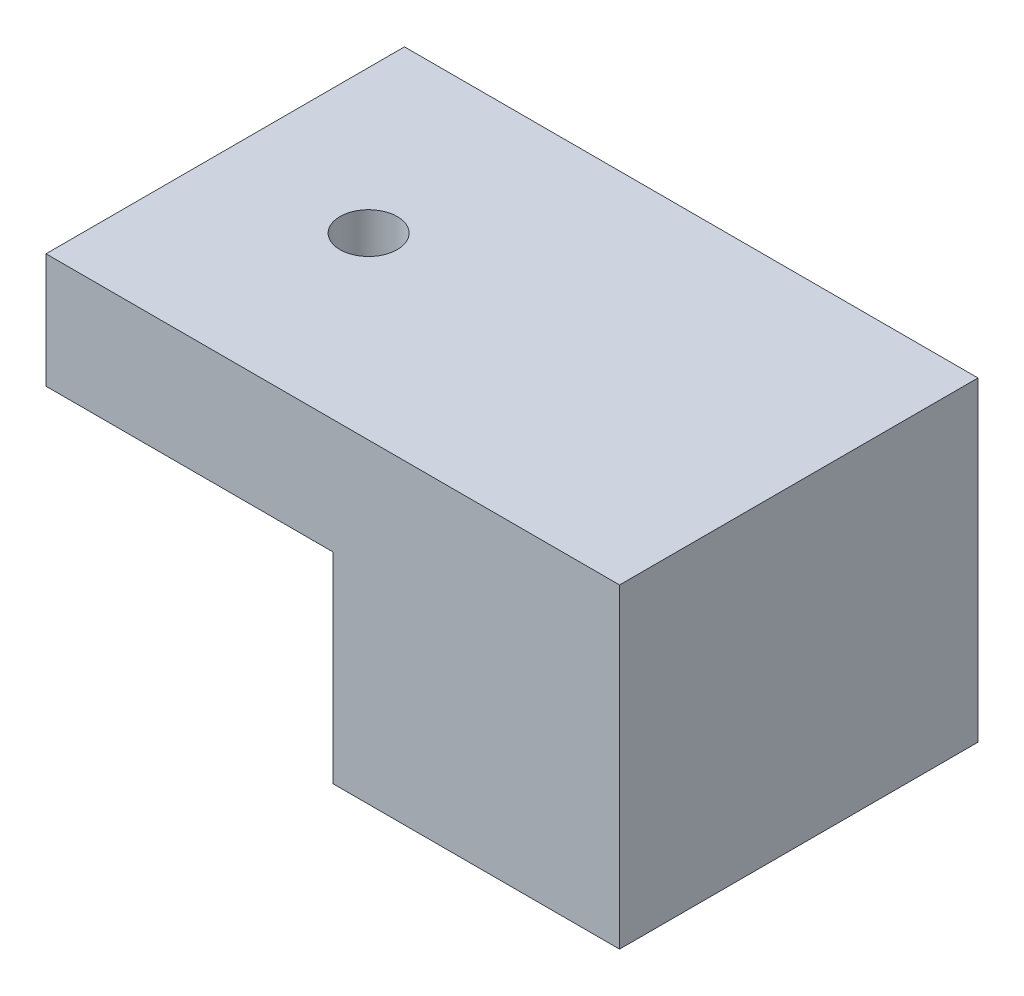
ISO-10303-21;
HEADER;
FILE_DESCRIPTION(('STEP AP214'),'2;1');
FILE_NAME('part.step','',(''),(''),'','','');
FILE_SCHEMA(('AUTOMOTIVE_DESIGN { 1 0 10303 214 1 1 1 1 }'));
ENDSEC;
DATA;
#1=APPLICATION_CONTEXT('core data for automotive mechanical design processes');
#2=APPLICATION_PROTOCOL_DEFINITION('international standard','automotive_design',2000,#1);
#3=PRODUCT_CONTEXT('',#1,'mechanical');
#4=PRODUCT('Part','Part','',(#3));
#5=PRODUCT_RELATED_PRODUCT_CATEGORY('part','',(#4));
#6=PRODUCT_DEFINITION_FORMATION('','',#4);
#7=PRODUCT_DEFINITION_CONTEXT('part definition',#1,'design');
#8=PRODUCT_DEFINITION('design','',#6,#7);
#9=PRODUCT_DEFINITION_SHAPE('','',#8);
#10=(LENGTH_UNIT() NAMED_UNIT(*) SI_UNIT(.MILLI.,.METRE.));
#11=(NAMED_UNIT(*) PLANE_ANGLE_UNIT() SI_UNIT($,.RADIAN.));
#12=(NAMED_UNIT(*) SI_UNIT($,.STERADIAN.) SOLID_ANGLE_UNIT());
#13=UNCERTAINTY_MEASURE_WITH_UNIT(LENGTH_MEASURE(1.E-05),#10,'distance_accuracy_value','');
#14=(GEOMETRIC_REPRESENTATION_CONTEXT(3) GLOBAL_UNCERTAINTY_ASSIGNED_CONTEXT((#13)) GLOBAL_UNIT_ASSIGNED_CONTEXT((#10,
#11,#12)) REPRESENTATION_CONTEXT('',''));
#15=CARTESIAN_POINT('',(0.,0.,0.));
#16=DIRECTION('',(0.,0.,1.));
#17=DIRECTION('',(1.,0.,0.));
#18=AXIS2_PLACEMENT_3D('',#15,#16,#17);
#19=CARTESIAN_POINT('',(0.,8.,25.));
#20=DIRECTION('',(1.,0.,0.));
#21=DIRECTION('',(0.,1.,0.));
#22=AXIS2_PLACEMENT_3D('',#19,#20,#21);
#23=PLANE('',#22);
#24=DIRECTION('',(0.,-1.,0.));
#25=VECTOR('',#24,1.);
#26=CARTESIAN_POINT('',(0.,8.,0.));
#27=LINE('',#26,#25);
#28=CARTESIAN_POINT('',(0.,8.,0.));
#29=VERTEX_POINT('',#28);
#30=CARTESIAN_POINT('',(0.,0.,0.));
#31=VERTEX_POINT('',#30);
#32=EDGE_CURVE('E128',#29,#31,#27,.T.);
#33=ORIENTED_EDGE('',*,*,#32,.T.);
#34=DIRECTION('',(0.,0.,-1.));
#35=VECTOR('',#34,1.);
#36=CARTESIAN_POINT('',(0.,0.,25.));
#37=LINE('',#36,#35);
#38=CARTESIAN_POINT('',(0.,0.,25.));
#39=VERTEX_POINT('',#38);
#40=EDGE_CURVE('E11',#39,#31,#37,.T.);
#41=ORIENTED_EDGE('',*,*,#40,.F.);
#42=DIRECTION('',(0.,-1.,0.));
#43=VECTOR('',#42,1.);
#44=CARTESIAN_POINT('',(0.,8.,25.));
#45=LINE('',#44,#43);
#46=CARTESIAN_POINT('',(0.,8.,25.));
#47=VERTEX_POINT('',#46);
#48=EDGE_CURVE('E145',#47,#39,#45,.T.);
#49=ORIENTED_EDGE('',*,*,#48,.F.);
#50=DIRECTION('',(0.,0.,-1.));
#51=VECTOR('',#50,1.);
#52=CARTESIAN_POINT('',(0.,8.,25.));
#53=LINE('',#52,#51);
#54=EDGE_CURVE('E124',#47,#29,#53,.T.);
#55=ORIENTED_EDGE('',*,*,#54,.T.);
#56=EDGE_LOOP('',(#33,#41,#49,#55));
#57=FACE_BOUND('',#56,.T.);
#58=ADVANCED_FACE('F39',(#57),#23,.F.);
#59=CARTESIAN_POINT('',(0.,0.,25.));
#60=DIRECTION('',(0.,1.,0.));
#61=DIRECTION('',(0.,0.,1.));
#62=AXIS2_PLACEMENT_3D('',#59,#60,#61);
#63=PLANE('',#62);
#64=CARTESIAN_POINT('',(10.,0.,12.5));
#65=DIRECTION('',(0.,1.,0.));
#66=DIRECTION('',(0.,0.,1.));
#67=AXIS2_PLACEMENT_3D('',#64,#65,#66);
#68=CIRCLE('',#67,2.);
#69=CARTESIAN_POINT('',(10.,0.,14.5));
#70=VERTEX_POINT('',#69);
#71=EDGE_CURVE('E133',#70,#70,#68,.T.);
#72=ORIENTED_EDGE('',*,*,#71,.T.);
#73=EDGE_LOOP('',(#72));
#74=FACE_BOUND('',#73,.T.);
#75=DIRECTION('',(1.,0.,0.));
#76=VECTOR('',#75,1.);
#77=CARTESIAN_POINT('',(0.,0.,0.));
#78=LINE('',#77,#76);
#79=CARTESIAN_POINT('',(20.,0.,0.));
#80=VERTEX_POINT('',#79);
#81=EDGE_CURVE('E132',#31,#80,#78,.T.);
#82=ORIENTED_EDGE('',*,*,#81,.T.);
#83=DIRECTION('',(0.,0.,-1.));
#84=VECTOR('',#83,1.);
#85=CARTESIAN_POINT('',(20.,0.,25.));
#86=LINE('',#85,#84);
#87=CARTESIAN_POINT('',(20.,0.,25.));
#88=VERTEX_POINT('',#87);
#89=EDGE_CURVE('E48',#88,#80,#86,.T.);
#90=ORIENTED_EDGE('',*,*,#89,.F.);
#91=DIRECTION('',(1.,0.,0.));
#92=VECTOR('',#91,1.);
#93=CARTESIAN_POINT('',(0.,0.,25.));
#94=LINE('',#93,#92);
#95=EDGE_CURVE('E93',#39,#88,#94,.T.);
#96=ORIENTED_EDGE('',*,*,#95,.F.);
#97=ORIENTED_EDGE('',*,*,#40,.T.);
#98=EDGE_LOOP('',(#82,#90,#96,#97));
#99=FACE_BOUND('',#98,.T.);
#100=ADVANCED_FACE('F175',(#74,#99),#63,.F.);
#101=CARTESIAN_POINT('',(20.,0.,25.));
#102=DIRECTION('',(1.,0.,0.));
#103=DIRECTION('',(0.,0.,-1.));
#104=AXIS2_PLACEMENT_3D('',#101,#102,#103);
#105=PLANE('',#104);
#106=DIRECTION('',(0.,-1.,0.));
#107=VECTOR('',#106,1.);
#108=CARTESIAN_POINT('',(20.,0.,0.));
#109=LINE('',#108,#107);
#110=CARTESIAN_POINT('',(20.,-14.,0.));
#111=VERTEX_POINT('',#110);
#112=EDGE_CURVE('E136',#80,#111,#109,.T.);
#113=ORIENTED_EDGE('',*,*,#112,.T.);
#114=DIRECTION('',(0.,0.,-1.));
#115=VECTOR('',#114,1.);
#116=CARTESIAN_POINT('',(20.,-14.,25.));
#117=LINE('',#116,#115);
#118=CARTESIAN_POINT('',(20.,-14.,25.));
#119=VERTEX_POINT('',#118);
#120=EDGE_CURVE('E117',#119,#111,#117,.T.);
#121=ORIENTED_EDGE('',*,*,#120,.F.);
#122=DIRECTION('',(0.,-1.,0.));
#123=VECTOR('',#122,1.);
#124=CARTESIAN_POINT('',(20.,0.,25.));
#125=LINE('',#124,#123);
#126=EDGE_CURVE('E106',#88,#119,#125,.T.);
#127=ORIENTED_EDGE('',*,*,#126,.F.);
#128=ORIENTED_EDGE('',*,*,#89,.T.);
#129=EDGE_LOOP('',(#113,#121,#127,#128));
#130=FACE_BOUND('',#129,.T.);
#131=ADVANCED_FACE('F155',(#130),#105,.F.);
#132=CARTESIAN_POINT('',(20.,-14.,25.));
#133=DIRECTION('',(0.,1.,0.));
#134=DIRECTION('',(0.,0.,1.));
#135=AXIS2_PLACEMENT_3D('',#132,#133,#134);
#136=PLANE('',#135);
#137=DIRECTION('',(1.,0.,0.));
#138=VECTOR('',#137,1.);
#139=CARTESIAN_POINT('',(20.,-14.,0.));
#140=LINE('',#139,#138);
#141=CARTESIAN_POINT('',(40.,-14.,0.));
#142=VERTEX_POINT('',#141);
#143=EDGE_CURVE('E115',#111,#142,#140,.T.);
#144=ORIENTED_EDGE('',*,*,#143,.T.);
#145=DIRECTION('',(0.,0.,-1.));
#146=VECTOR('',#145,1.);
#147=CARTESIAN_POINT('',(40.,-14.,25.));
#148=LINE('',#147,#146);
#149=CARTESIAN_POINT('',(40.,-14.,25.));
#150=VERTEX_POINT('',#149);
#151=EDGE_CURVE('E112',#150,#142,#148,.T.);
#152=ORIENTED_EDGE('',*,*,#151,.F.);
#153=DIRECTION('',(1.,0.,0.));
#154=VECTOR('',#153,1.);
#155=CARTESIAN_POINT('',(20.,-14.,25.));
#156=LINE('',#155,#154);
#157=EDGE_CURVE('E100',#119,#150,#156,.T.);
#158=ORIENTED_EDGE('',*,*,#157,.F.);
#159=ORIENTED_EDGE('',*,*,#120,.T.);
#160=EDGE_LOOP('',(#144,#152,#158,#159));
#161=FACE_BOUND('',#160,.T.);
#162=ADVANCED_FACE('F113',(#161),#136,.F.);
#163=CARTESIAN_POINT('',(40.,-14.,25.));
#164=DIRECTION('',(-1.,0.,0.));
#165=DIRECTION('',(0.,0.,1.));
#166=AXIS2_PLACEMENT_3D('',#163,#164,#165);
#167=PLANE('',#166);
#168=DIRECTION('',(0.,1.,0.));
#169=VECTOR('',#168,1.);
#170=CARTESIAN_POINT('',(40.,-14.,0.));
#171=LINE('',#170,#169);
#172=CARTESIAN_POINT('',(40.,8.00000000000001,0.));
#173=VERTEX_POINT('',#172);
#174=EDGE_CURVE('E79',#142,#173,#171,.T.);
#175=ORIENTED_EDGE('',*,*,#174,.T.);
#176=DIRECTION('',(0.,0.,-1.));
#177=VECTOR('',#176,1.);
#178=CARTESIAN_POINT('',(40.,8.00000000000001,25.));
#179=LINE('',#178,#177);
#180=CARTESIAN_POINT('',(40.,8.00000000000001,25.));
#181=VERTEX_POINT('',#180);
#182=EDGE_CURVE('E118',#181,#173,#179,.T.);
#183=ORIENTED_EDGE('',*,*,#182,.F.);
#184=DIRECTION('',(0.,1.,0.));
#185=VECTOR('',#184,1.);
#186=CARTESIAN_POINT('',(40.,-14.,25.));
#187=LINE('',#186,#185);
#188=EDGE_CURVE('E104',#150,#181,#187,.T.);
#189=ORIENTED_EDGE('',*,*,#188,.F.);
#190=ORIENTED_EDGE('',*,*,#151,.T.);
#191=EDGE_LOOP('',(#175,#183,#189,#190));
#192=FACE_BOUND('',#191,.T.);
#193=ADVANCED_FACE('F120',(#192),#167,.F.);
#194=CARTESIAN_POINT('',(40.,8.00000000000001,25.));
#195=DIRECTION('',(0.,-1.,0.));
#196=DIRECTION('',(1.,0.,0.));
#197=AXIS2_PLACEMENT_3D('',#194,#195,#196);
#198=PLANE('',#197);
#199=CARTESIAN_POINT('',(10.,8.00000000000001,12.5));
#200=DIRECTION('',(0.,-1.,0.));
#201=DIRECTION('',(0.,0.,-1.));
#202=AXIS2_PLACEMENT_3D('',#199,#200,#201);
#203=CIRCLE('',#202,2.);
#204=CARTESIAN_POINT('',(10.,8.00000000000001,10.5));
#205=VERTEX_POINT('',#204);
#206=EDGE_CURVE('E234',#205,#205,#203,.T.);
#207=ORIENTED_EDGE('',*,*,#206,.T.);
#208=EDGE_LOOP('',(#207));
#209=FACE_BOUND('',#208,.T.);
#210=DIRECTION('',(-1.,0.,0.));
#211=VECTOR('',#210,1.);
#212=CARTESIAN_POINT('',(40.,8.00000000000001,0.));
#213=LINE('',#212,#211);
#214=EDGE_CURVE('E85',#173,#29,#213,.T.);
#215=ORIENTED_EDGE('',*,*,#214,.T.);
#216=ORIENTED_EDGE('',*,*,#54,.F.);
#217=DIRECTION('',(-1.,0.,0.));
#218=VECTOR('',#217,1.);
#219=CARTESIAN_POINT('',(40.,8.00000000000001,25.));
#220=LINE('',#219,#218);
#221=EDGE_CURVE('E56',#181,#47,#220,.T.);
#222=ORIENTED_EDGE('',*,*,#221,.F.);
#223=ORIENTED_EDGE('',*,*,#182,.T.);
#224=EDGE_LOOP('',(#215,#216,#222,#223));
#225=FACE_BOUND('',#224,.T.);
#226=ADVANCED_FACE('F162',(#209,#225),#198,.F.);
#227=CARTESIAN_POINT('',(0.,0.,25.));
#228=DIRECTION('',(0.,0.,1.));
#229=DIRECTION('',(1.,0.,0.));
#230=AXIS2_PLACEMENT_3D('',#227,#228,#229);
#231=PLANE('',#230);
#232=ORIENTED_EDGE('',*,*,#48,.T.);
#233=ORIENTED_EDGE('',*,*,#95,.T.);
#234=ORIENTED_EDGE('',*,*,#126,.T.);
#235=ORIENTED_EDGE('',*,*,#157,.T.);
#236=ORIENTED_EDGE('',*,*,#188,.T.);
#237=ORIENTED_EDGE('',*,*,#221,.T.);
#238=EDGE_LOOP('',(#232,#233,#234,#235,#236,#237));
#239=FACE_BOUND('',#238,.T.);
#240=ADVANCED_FACE('F102',(#239),#231,.T.);
#241=CARTESIAN_POINT('',(0.,0.,0.));
#242=DIRECTION('',(0.,0.,1.));
#243=DIRECTION('',(1.,0.,0.));
#244=AXIS2_PLACEMENT_3D('',#241,#242,#243);
#245=PLANE('',#244);
#246=ORIENTED_EDGE('',*,*,#32,.F.);
#247=ORIENTED_EDGE('',*,*,#214,.F.);
#248=ORIENTED_EDGE('',*,*,#174,.F.);
#249=ORIENTED_EDGE('',*,*,#143,.F.);
#250=ORIENTED_EDGE('',*,*,#112,.F.);
#251=ORIENTED_EDGE('',*,*,#81,.F.);
#252=EDGE_LOOP('',(#246,#247,#248,#249,#250,#251));
#253=FACE_BOUND('',#252,.T.);
#254=ADVANCED_FACE('F158',(#253),#245,.F.);
#255=CARTESIAN_POINT('',(10.,8.00000000000001,12.5));
#256=DIRECTION('',(0.,-1.,0.));
#257=DIRECTION('',(0.,0.,-1.));
#258=AXIS2_PLACEMENT_3D('',#255,#256,#257);
#259=CYLINDRICAL_SURFACE('',#258,2.);
#260=ORIENTED_EDGE('',*,*,#206,.F.);
#261=EDGE_LOOP('',(#260));
#262=FACE_BOUND('',#261,.T.);
#263=ORIENTED_EDGE('',*,*,#71,.F.);
#264=EDGE_LOOP('',(#263));
#265=FACE_BOUND('',#264,.T.);
#266=ADVANCED_FACE('F210',(#262,#265),#259,.F.);
#267=CLOSED_SHELL('',(#58,#100,#131,#162,#193,#226,#240,#254,#266));
#268=MANIFOLD_SOLID_BREP('B2',#267);
#269=ADVANCED_BREP_SHAPE_REPRESENTATION('',(#18,#268),#14);
#270=SHAPE_DEFINITION_REPRESENTATION(#9,#269);
ENDSEC;
END-ISO-10303-21;
